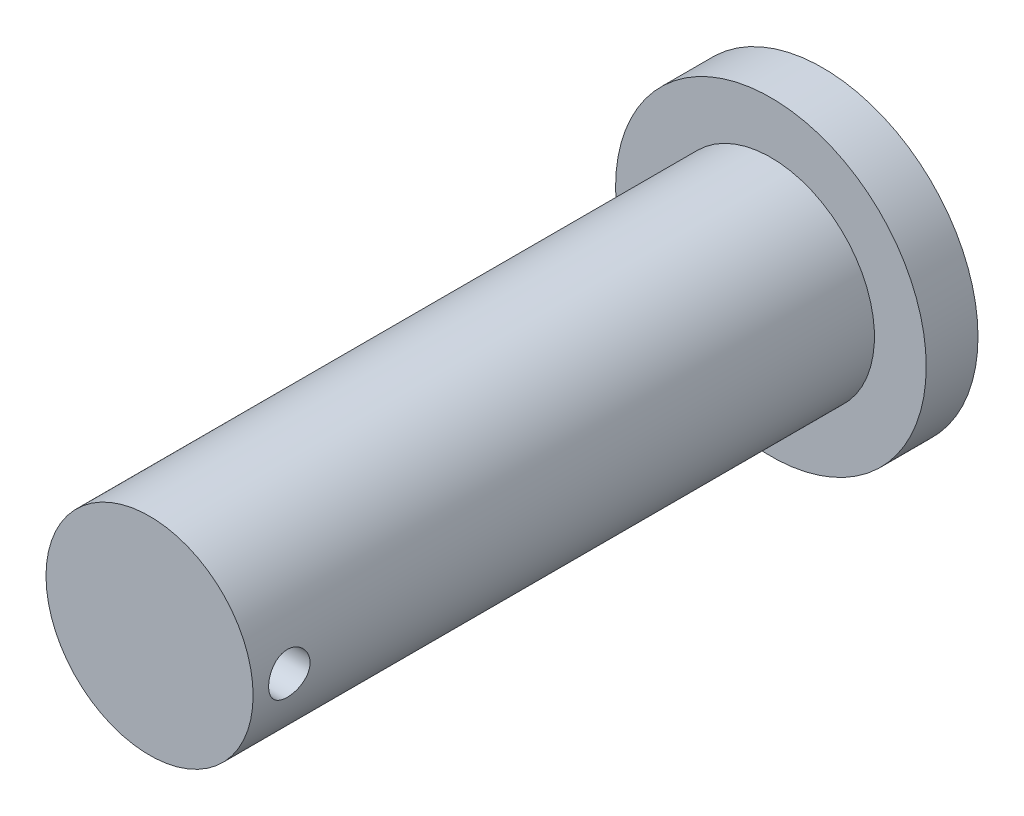
ISO-10303-21;
HEADER;
FILE_DESCRIPTION(('STEP AP214'),'2;1');
FILE_NAME('part.step','',(''),(''),'','','');
FILE_SCHEMA(('AUTOMOTIVE_DESIGN { 1 0 10303 214 1 1 1 1 }'));
ENDSEC;
DATA;
#1=APPLICATION_CONTEXT('core data for automotive mechanical design processes');
#2=APPLICATION_PROTOCOL_DEFINITION('international standard','automotive_design',2000,#1);
#3=PRODUCT_CONTEXT('',#1,'mechanical');
#4=PRODUCT('Part','Part','',(#3));
#5=PRODUCT_RELATED_PRODUCT_CATEGORY('part','',(#4));
#6=PRODUCT_DEFINITION_FORMATION('','',#4);
#7=PRODUCT_DEFINITION_CONTEXT('part definition',#1,'design');
#8=PRODUCT_DEFINITION('design','',#6,#7);
#9=PRODUCT_DEFINITION_SHAPE('','',#8);
#10=(LENGTH_UNIT() NAMED_UNIT(*) SI_UNIT(.MILLI.,.METRE.));
#11=(NAMED_UNIT(*) PLANE_ANGLE_UNIT() SI_UNIT($,.RADIAN.));
#12=(NAMED_UNIT(*) SI_UNIT($,.STERADIAN.) SOLID_ANGLE_UNIT());
#13=UNCERTAINTY_MEASURE_WITH_UNIT(LENGTH_MEASURE(1.E-05),#10,'distance_accuracy_value','');
#14=(GEOMETRIC_REPRESENTATION_CONTEXT(3) GLOBAL_UNCERTAINTY_ASSIGNED_CONTEXT((#13)) GLOBAL_UNIT_ASSIGNED_CONTEXT((#10,
#11,#12)) REPRESENTATION_CONTEXT('',''));
#15=CARTESIAN_POINT('',(0.,0.,0.));
#16=DIRECTION('',(0.,0.,1.));
#17=DIRECTION('',(1.,0.,0.));
#18=AXIS2_PLACEMENT_3D('',#15,#16,#17);
#19=CARTESIAN_POINT('',(0.,0.,32.5));
#20=DIRECTION('',(0.,0.,-1.));
#21=DIRECTION('',(-1.,0.,0.));
#22=AXIS2_PLACEMENT_3D('',#19,#20,#21);
#23=CYLINDRICAL_SURFACE('',#22,5.);
#24=CARTESIAN_POINT('',(-5.,0.,31.75));
#25=CARTESIAN_POINT('',(-4.99999897580871,0.0555769067926332,31.7499979555017));
#26=CARTESIAN_POINT('',(-4.99906385178231,0.111179660201522,31.7453511570324));
#27=CARTESIAN_POINT('',(-4.99542365623231,0.220813507689019,31.7269014998848));
#28=CARTESIAN_POINT('',(-4.99271717860186,0.274843317541356,31.7130913671985));
#29=CARTESIAN_POINT('',(-4.98583649278287,0.379730305263314,31.6767587263792));
#30=CARTESIAN_POINT('',(-4.98166369076718,0.430590467933135,31.6542445631553));
#31=CARTESIAN_POINT('',(-4.97230398035314,0.527807988864227,31.6011677524887));
#32=CARTESIAN_POINT('',(-4.96711713235707,0.574165615075812,31.5706055843928));
#33=CARTESIAN_POINT('',(-4.9562216532997,0.661693477314864,31.5018615057086));
#34=CARTESIAN_POINT('',(-4.95050745504347,0.702793951158523,31.4635916446088));
#35=CARTESIAN_POINT('',(-4.93924180452588,0.778036756608027,31.3807075836083));
#36=CARTESIAN_POINT('',(-4.93369036500424,0.812178544770423,31.3360928886649));
#37=CARTESIAN_POINT('',(-4.92332441812615,0.87283175334762,31.2412838069881));
#38=CARTESIAN_POINT('',(-4.91851707364946,0.899270938865867,31.1910423562036));
#39=CARTESIAN_POINT('',(-4.91026268058418,0.94330566658031,31.0867181809959));
#40=CARTESIAN_POINT('',(-4.90681549761962,0.960902082437239,31.0326358366537));
#41=CARTESIAN_POINT('',(-4.90172805252205,0.986525299884828,30.9229156360921));
#42=CARTESIAN_POINT('',(-4.90006470107188,0.994674497958778,30.8673074558578));
#43=CARTESIAN_POINT('',(-4.89866375060627,1.00155212772612,30.7554901786357));
#44=CARTESIAN_POINT('',(-4.89892595467841,1.0002815227135,30.6992811436799));
#45=CARTESIAN_POINT('',(-4.90132551148185,0.98845457310182,30.588753211979));
#46=CARTESIAN_POINT('',(-4.90343452858764,0.978038540243907,30.5344185943727));
#47=CARTESIAN_POINT('',(-4.90924546160001,0.948437884623053,30.428283923337));
#48=CARTESIAN_POINT('',(-4.91294745357779,0.929252843100683,30.376483991081));
#49=CARTESIAN_POINT('',(-4.92155618500408,0.882524783674722,30.2764847382964));
#50=CARTESIAN_POINT('',(-4.92647089813704,0.854926151232117,30.2283121204308));
#51=CARTESIAN_POINT('',(-4.93694618773062,0.792193574572681,30.1372291500272));
#52=CARTESIAN_POINT('',(-4.94250683838366,0.757058764356831,30.0943194031488));
#53=CARTESIAN_POINT('',(-4.95377021241462,0.679499934560586,30.0141705975431));
#54=CARTESIAN_POINT('',(-4.95947369210905,0.636956161212447,29.9770474321409));
#55=CARTESIAN_POINT('',(-4.97028848714409,0.546185024062011,29.9104461536988));
#56=CARTESIAN_POINT('',(-4.97539979488974,0.497957587379389,29.8809681387064));
#57=CARTESIAN_POINT('',(-4.98446690160887,0.397059386878921,29.830472490774));
#58=CARTESIAN_POINT('',(-4.98842088848272,0.3443818195853,29.8094681063555));
#59=CARTESIAN_POINT('',(-4.99471408987858,0.236148976448665,29.7766395259614));
#60=CARTESIAN_POINT('',(-4.99705350000531,0.18059405007245,29.7648142179264));
#61=CARTESIAN_POINT('',(-4.99982671866868,0.0691794056271514,29.7508435462057));
#62=CARTESIAN_POINT('',(-5.0002917465247,0.0133403283255772,29.7485395804597));
#63=CARTESIAN_POINT('',(-4.99935051930103,-0.097924934192713,29.7532498589422));
#64=CARTESIAN_POINT('',(-4.99794436941446,-0.153351142443792,29.7602635793526));
#65=CARTESIAN_POINT('',(-4.99343832008018,-0.26170565994654,29.783278373544));
#66=CARTESIAN_POINT('',(-4.99035376404206,-0.314651948339902,29.7991980684979));
#67=CARTESIAN_POINT('',(-4.98283552061033,-0.417123627499666,29.8394839826558));
#68=CARTESIAN_POINT('',(-4.97840173214227,-0.466648761637539,29.8638508346768));
#69=CARTESIAN_POINT('',(-4.96859911533295,-0.561541173686217,29.9206824906513));
#70=CARTESIAN_POINT('',(-4.96321950437052,-0.606850126752187,29.9532427810389));
#71=CARTESIAN_POINT('',(-4.95214734829882,-0.691418019119206,30.0254091912073));
#72=CARTESIAN_POINT('',(-4.94645476968388,-0.730676308930762,30.0650160663999));
#73=CARTESIAN_POINT('',(-4.93529303556965,-0.802640590774177,30.1508733518911));
#74=CARTESIAN_POINT('',(-4.92982860233304,-0.835237702448658,30.1972157442213));
#75=CARTESIAN_POINT('',(-4.91984191796194,-0.892185420051208,30.2948113613567));
#76=CARTESIAN_POINT('',(-4.91531962913343,-0.916536355922904,30.3460643895736));
#77=CARTESIAN_POINT('',(-4.90776740584383,-0.956151841581961,30.4517682461496));
#78=CARTESIAN_POINT('',(-4.90472974872187,-0.971463499791052,30.5062008412103));
#79=CARTESIAN_POINT('',(-4.90047436792025,-0.992708651627198,30.6169334534909));
#80=CARTESIAN_POINT('',(-4.89925640691111,-0.998643368225114,30.6732332262094));
#81=CARTESIAN_POINT('',(-4.89879149631379,-1.00092091086747,30.7850088645443));
#82=CARTESIAN_POINT('',(-4.89950919189301,-0.997435788070897,30.840481148927));
#83=CARTESIAN_POINT('',(-4.90275573484614,-0.981352304100062,30.950031649905));
#84=CARTESIAN_POINT('',(-4.90528456767169,-0.9687540161293,31.0041098776948));
#85=CARTESIAN_POINT('',(-4.91185264219159,-0.934878568498956,31.1092277112405));
#86=CARTESIAN_POINT('',(-4.91588821018831,-0.913622506717347,31.1602743605024));
#87=CARTESIAN_POINT('',(-4.9250171497417,-0.863054644601606,31.2581037207344));
#88=CARTESIAN_POINT('',(-4.93011060998894,-0.833742168774884,31.3048860737251));
#89=CARTESIAN_POINT('',(-4.94088960523225,-0.767305914786416,31.3937155721503));
#90=CARTESIAN_POINT('',(-4.946583729097,-0.730057887235183,31.4356687652676));
#91=CARTESIAN_POINT('',(-4.95786081871955,-0.649064369013143,31.5127862055292));
#92=CARTESIAN_POINT('',(-4.96344375863184,-0.605317387153336,31.5479488903173));
#93=CARTESIAN_POINT('',(-4.97393832387971,-0.512017629088247,31.6108346439465));
#94=CARTESIAN_POINT('',(-4.97884231219246,-0.462408884429836,31.63847600328));
#95=CARTESIAN_POINT('',(-4.98735125085,-0.359166360940734,31.6849861225966));
#96=CARTESIAN_POINT('',(-4.99095737138616,-0.305536260863127,31.7038627895325));
#97=CARTESIAN_POINT('',(-4.99576372595371,-0.20982148892378,31.7286519480447));
#98=CARTESIAN_POINT('',(-4.99734303158452,-0.168281664013786,31.7366431937078));
#99=CARTESIAN_POINT('',(-4.99946154139893,-0.0844995252100676,31.7473179123584));
#100=CARTESIAN_POINT('',(-5.00000077873155,-0.0422572337486192,31.7500015545098));
#101=CARTESIAN_POINT('',(-5.,0.,31.75));
#102=B_SPLINE_CURVE_WITH_KNOTS('',3,(#24,#25,#26,#27,#28,#29,#30,#31,#32,#33,#34,#35,#36,#37,
#38,#39,#40,#41,#42,#43,#44,#45,#46,#47,#48,#49,#50,#51,#52,#53,#54,#55,#56,#57,#58,#59,#60,#61,
#62,#63,#64,#65,#66,#67,#68,#69,#70,#71,#72,#73,#74,#75,#76,#77,#78,#79,#80,#81,#82,#83,#84,#85,
#86,#87,#88,#89,#90,#91,#92,#93,#94,#95,#96,#97,#98,#99,#100,#101),.UNSPECIFIED.,.T.,.F.,(4,2,2,
2,2,2,2,2,2,2,2,2,2,2,2,2,2,2,2,2,2,2,2,2,2,2,2,2,2,2,2,2,2,2,2,2,2,2,4),(0.,0.166576130661258,
0.333284650691323,0.499833735250344,0.666372902230866,0.834932670112183,1.00350559674736,
1.17361195005923,1.34370149365198,1.51156185103587,1.67940504281225,1.84471727006278,
2.0100373925373,2.17647490203593,2.3429315474967,2.51238252491351,2.68183567539821,
2.85155274854024,3.02124925698036,3.18810735676266,3.35495607657868,3.52030453950724,
3.68566539216023,3.85305066033359,4.0204538834593,4.19040628579227,4.36035188723467,
4.52940381032724,4.69843368330415,4.86439722567702,5.03035943492609,5.1959196125311,
5.36149367581867,5.52988076239144,5.69830654532931,5.86849496675638,6.03852955517519,
6.16518775289895,6.29184191370997),.UNSPECIFIED.);
#103=CARTESIAN_POINT('',(-5.,0.,31.75));
#104=VERTEX_POINT('',#103);
#105=EDGE_CURVE('E49',#104,#104,#102,.T.);
#106=ORIENTED_EDGE('',*,*,#105,.F.);
#107=EDGE_LOOP('',(#106));
#108=FACE_BOUND('',#107,.T.);
#109=CARTESIAN_POINT('',(5.,0.,31.75));
#110=CARTESIAN_POINT('',(4.99999897580871,-0.0555769067926332,31.7499979555017));
#111=CARTESIAN_POINT('',(4.99906385178231,-0.111179660201522,31.7453511570324));
#112=CARTESIAN_POINT('',(4.99542365623231,-0.220813507689019,31.7269014998848));
#113=CARTESIAN_POINT('',(4.99271717860186,-0.274843317541356,31.7130913671985));
#114=CARTESIAN_POINT('',(4.98583649278287,-0.379730305263314,31.6767587263792));
#115=CARTESIAN_POINT('',(4.98166369076718,-0.430590467933135,31.6542445631553));
#116=CARTESIAN_POINT('',(4.97230398035314,-0.527807988864227,31.6011677524887));
#117=CARTESIAN_POINT('',(4.96711713235707,-0.574165615075812,31.5706055843928));
#118=CARTESIAN_POINT('',(4.9562216532997,-0.661693477314864,31.5018615057086));
#119=CARTESIAN_POINT('',(4.95050745504347,-0.702793951158523,31.4635916446088));
#120=CARTESIAN_POINT('',(4.93924180452588,-0.778036756608027,31.3807075836083));
#121=CARTESIAN_POINT('',(4.93369036500424,-0.812178544770423,31.3360928886649));
#122=CARTESIAN_POINT('',(4.92332441812615,-0.87283175334762,31.2412838069881));
#123=CARTESIAN_POINT('',(4.91851707364946,-0.899270938865867,31.1910423562036));
#124=CARTESIAN_POINT('',(4.91026268058418,-0.94330566658031,31.0867181809959));
#125=CARTESIAN_POINT('',(4.90681549761962,-0.960902082437239,31.0326358366537));
#126=CARTESIAN_POINT('',(4.90172805252205,-0.986525299884828,30.9229156360921));
#127=CARTESIAN_POINT('',(4.90006470107188,-0.994674497958778,30.8673074558578));
#128=CARTESIAN_POINT('',(4.89866375060627,-1.00155212772612,30.7554901786357));
#129=CARTESIAN_POINT('',(4.89892595467841,-1.0002815227135,30.6992811436799));
#130=CARTESIAN_POINT('',(4.90132551148185,-0.98845457310182,30.588753211979));
#131=CARTESIAN_POINT('',(4.90343452858764,-0.978038540243907,30.5344185943727));
#132=CARTESIAN_POINT('',(4.90924546160001,-0.948437884623053,30.428283923337));
#133=CARTESIAN_POINT('',(4.91294745357779,-0.929252843100683,30.376483991081));
#134=CARTESIAN_POINT('',(4.92155618500408,-0.882524783674722,30.2764847382964));
#135=CARTESIAN_POINT('',(4.92647089813704,-0.854926151232117,30.2283121204308));
#136=CARTESIAN_POINT('',(4.93694618773062,-0.792193574572681,30.1372291500272));
#137=CARTESIAN_POINT('',(4.94250683838366,-0.757058764356831,30.0943194031488));
#138=CARTESIAN_POINT('',(4.95377021241462,-0.679499934560586,30.0141705975431));
#139=CARTESIAN_POINT('',(4.95947369210905,-0.636956161212447,29.9770474321409));
#140=CARTESIAN_POINT('',(4.97028848714409,-0.546185024062011,29.9104461536988));
#141=CARTESIAN_POINT('',(4.97539979488974,-0.497957587379389,29.8809681387064));
#142=CARTESIAN_POINT('',(4.98446690160887,-0.397059386878921,29.830472490774));
#143=CARTESIAN_POINT('',(4.98842088848272,-0.3443818195853,29.8094681063555));
#144=CARTESIAN_POINT('',(4.99471408987858,-0.236148976448665,29.7766395259614));
#145=CARTESIAN_POINT('',(4.99705350000531,-0.18059405007245,29.7648142179264));
#146=CARTESIAN_POINT('',(4.99982671866868,-0.0691794056271514,29.7508435462057));
#147=CARTESIAN_POINT('',(5.0002917465247,-0.0133403283255772,29.7485395804597));
#148=CARTESIAN_POINT('',(4.99935051930103,0.097924934192713,29.7532498589422));
#149=CARTESIAN_POINT('',(4.99794436941446,0.153351142443792,29.7602635793526));
#150=CARTESIAN_POINT('',(4.99343832008018,0.26170565994654,29.783278373544));
#151=CARTESIAN_POINT('',(4.99035376404206,0.314651948339902,29.7991980684979));
#152=CARTESIAN_POINT('',(4.98283552061033,0.417123627499666,29.8394839826558));
#153=CARTESIAN_POINT('',(4.97840173214227,0.466648761637539,29.8638508346768));
#154=CARTESIAN_POINT('',(4.96859911533295,0.561541173686217,29.9206824906513));
#155=CARTESIAN_POINT('',(4.96321950437052,0.606850126752187,29.9532427810389));
#156=CARTESIAN_POINT('',(4.95214734829882,0.691418019119206,30.0254091912073));
#157=CARTESIAN_POINT('',(4.94645476968388,0.730676308930762,30.0650160663999));
#158=CARTESIAN_POINT('',(4.93529303556965,0.802640590774177,30.1508733518911));
#159=CARTESIAN_POINT('',(4.92982860233304,0.835237702448658,30.1972157442213));
#160=CARTESIAN_POINT('',(4.91984191796194,0.892185420051208,30.2948113613567));
#161=CARTESIAN_POINT('',(4.91531962913343,0.916536355922904,30.3460643895736));
#162=CARTESIAN_POINT('',(4.90776740584383,0.956151841581961,30.4517682461496));
#163=CARTESIAN_POINT('',(4.90472974872187,0.971463499791052,30.5062008412103));
#164=CARTESIAN_POINT('',(4.90047436792025,0.992708651627198,30.6169334534909));
#165=CARTESIAN_POINT('',(4.89925640691111,0.998643368225114,30.6732332262094));
#166=CARTESIAN_POINT('',(4.89879149631379,1.00092091086747,30.7850088645443));
#167=CARTESIAN_POINT('',(4.89950919189301,0.997435788070897,30.840481148927));
#168=CARTESIAN_POINT('',(4.90275573484614,0.981352304100062,30.950031649905));
#169=CARTESIAN_POINT('',(4.90528456767169,0.9687540161293,31.0041098776948));
#170=CARTESIAN_POINT('',(4.91185264219159,0.934878568498956,31.1092277112405));
#171=CARTESIAN_POINT('',(4.91588821018831,0.913622506717347,31.1602743605024));
#172=CARTESIAN_POINT('',(4.9250171497417,0.863054644601606,31.2581037207344));
#173=CARTESIAN_POINT('',(4.93011060998894,0.833742168774884,31.3048860737251));
#174=CARTESIAN_POINT('',(4.94088960523225,0.767305914786416,31.3937155721503));
#175=CARTESIAN_POINT('',(4.946583729097,0.730057887235183,31.4356687652676));
#176=CARTESIAN_POINT('',(4.95786081871955,0.649064369013143,31.5127862055292));
#177=CARTESIAN_POINT('',(4.96344375863184,0.605317387153336,31.5479488903173));
#178=CARTESIAN_POINT('',(4.97393832387971,0.512017629088247,31.6108346439465));
#179=CARTESIAN_POINT('',(4.97884231219246,0.462408884429836,31.63847600328));
#180=CARTESIAN_POINT('',(4.98735125085,0.359166360940734,31.6849861225966));
#181=CARTESIAN_POINT('',(4.99095737138616,0.305536260863127,31.7038627895325));
#182=CARTESIAN_POINT('',(4.99576372595371,0.20982148892378,31.7286519480447));
#183=CARTESIAN_POINT('',(4.99734303158452,0.168281664013786,31.7366431937078));
#184=CARTESIAN_POINT('',(4.99946154139893,0.0844995252100676,31.7473179123584));
#185=CARTESIAN_POINT('',(5.00000077873155,0.0422572337486192,31.7500015545098));
#186=CARTESIAN_POINT('',(5.,0.,31.75));
#187=B_SPLINE_CURVE_WITH_KNOTS('',3,(#109,#110,#111,#112,#113,#114,#115,#116,#117,#118,#119,
#120,#121,#122,#123,#124,#125,#126,#127,#128,#129,#130,#131,#132,#133,#134,#135,#136,#137,#138,
#139,#140,#141,#142,#143,#144,#145,#146,#147,#148,#149,#150,#151,#152,#153,#154,#155,#156,#157,
#158,#159,#160,#161,#162,#163,#164,#165,#166,#167,#168,#169,#170,#171,#172,#173,#174,#175,#176,
#177,#178,#179,#180,#181,#182,#183,#184,#185,#186),.UNSPECIFIED.,.T.,.F.,(4,2,2,2,2,2,2,2,2,2,2,
2,2,2,2,2,2,2,2,2,2,2,2,2,2,2,2,2,2,2,2,2,2,2,2,2,2,2,4),(0.,0.166576130661258,
0.333284650691323,0.499833735250344,0.666372902230866,0.834932670112183,1.00350559674736,
1.17361195005923,1.34370149365198,1.51156185103587,1.67940504281225,1.84471727006278,
2.0100373925373,2.17647490203593,2.3429315474967,2.51238252491351,2.68183567539821,
2.85155274854024,3.02124925698036,3.18810735676266,3.35495607657868,3.52030453950724,
3.68566539216023,3.85305066033359,4.0204538834593,4.19040628579227,4.36035188723467,
4.52940381032724,4.69843368330415,4.86439722567702,5.03035943492609,5.1959196125311,
5.36149367581867,5.52988076239144,5.69830654532931,5.86849496675638,6.03852955517519,
6.16518775289895,6.29184191370997),.UNSPECIFIED.);
#188=CARTESIAN_POINT('',(5.,0.,31.75));
#189=VERTEX_POINT('',#188);
#190=EDGE_CURVE('E54',#189,#189,#187,.T.);
#191=ORIENTED_EDGE('',*,*,#190,.F.);
#192=EDGE_LOOP('',(#191));
#193=FACE_BOUND('',#192,.T.);
#194=CARTESIAN_POINT('',(0.,0.,32.5));
#195=DIRECTION('',(0.,0.,1.));
#196=DIRECTION('',(1.,0.,0.));
#197=AXIS2_PLACEMENT_3D('',#194,#195,#196);
#198=CIRCLE('',#197,5.);
#199=CARTESIAN_POINT('',(5.,0.,32.5));
#200=VERTEX_POINT('',#199);
#201=EDGE_CURVE('E45',#200,#200,#198,.T.);
#202=ORIENTED_EDGE('',*,*,#201,.F.);
#203=EDGE_LOOP('',(#202));
#204=FACE_BOUND('',#203,.T.);
#205=CARTESIAN_POINT('',(0.,0.,2.5));
#206=DIRECTION('',(0.,0.,-1.));
#207=DIRECTION('',(-1.,0.,0.));
#208=AXIS2_PLACEMENT_3D('',#205,#206,#207);
#209=CIRCLE('',#208,5.);
#210=CARTESIAN_POINT('',(-5.,0.,2.5));
#211=VERTEX_POINT('',#210);
#212=EDGE_CURVE('E10',#211,#211,#209,.T.);
#213=ORIENTED_EDGE('',*,*,#212,.F.);
#214=EDGE_LOOP('',(#213));
#215=FACE_BOUND('',#214,.T.);
#216=ADVANCED_FACE('F38',(#108,#193,#204,#215),#23,.T.);
#217=CARTESIAN_POINT('',(0.,0.,32.5));
#218=DIRECTION('',(0.,0.,1.));
#219=DIRECTION('',(1.,0.,0.));
#220=AXIS2_PLACEMENT_3D('',#217,#218,#219);
#221=PLANE('',#220);
#222=ORIENTED_EDGE('',*,*,#201,.T.);
#223=EDGE_LOOP('',(#222));
#224=FACE_BOUND('',#223,.T.);
#225=ADVANCED_FACE('F74',(#224),#221,.T.);
#226=CARTESIAN_POINT('',(9.,0.,30.75));
#227=DIRECTION('',(-1.,0.,0.));
#228=DIRECTION('',(0.,0.,1.));
#229=AXIS2_PLACEMENT_3D('',#226,#227,#228);
#230=CYLINDRICAL_SURFACE('',#229,1.);
#231=ORIENTED_EDGE('',*,*,#190,.T.);
#232=EDGE_LOOP('',(#231));
#233=FACE_BOUND('',#232,.T.);
#234=ORIENTED_EDGE('',*,*,#105,.T.);
#235=EDGE_LOOP('',(#234));
#236=FACE_BOUND('',#235,.T.);
#237=ADVANCED_FACE('F68',(#233,#236),#230,.F.);
#238=CARTESIAN_POINT('',(0.,0.,2.5));
#239=DIRECTION('',(0.,0.,-1.));
#240=DIRECTION('',(-1.,0.,0.));
#241=AXIS2_PLACEMENT_3D('',#238,#239,#240);
#242=CYLINDRICAL_SURFACE('',#241,7.5);
#243=CARTESIAN_POINT('',(0.,0.,2.5));
#244=DIRECTION('',(0.,0.,-1.));
#245=DIRECTION('',(-1.,0.,0.));
#246=AXIS2_PLACEMENT_3D('',#243,#244,#245);
#247=CIRCLE('',#246,7.5);
#248=CARTESIAN_POINT('',(-7.5,0.,2.5));
#249=VERTEX_POINT('',#248);
#250=EDGE_CURVE('E64',#249,#249,#247,.T.);
#251=ORIENTED_EDGE('',*,*,#250,.T.);
#252=EDGE_LOOP('',(#251));
#253=FACE_BOUND('',#252,.T.);
#254=CARTESIAN_POINT('',(0.,0.,0.));
#255=DIRECTION('',(0.,0.,-1.));
#256=DIRECTION('',(-1.,0.,0.));
#257=AXIS2_PLACEMENT_3D('',#254,#255,#256);
#258=CIRCLE('',#257,7.5);
#259=CARTESIAN_POINT('',(-7.5,0.,0.));
#260=VERTEX_POINT('',#259);
#261=EDGE_CURVE('E57',#260,#260,#258,.T.);
#262=ORIENTED_EDGE('',*,*,#261,.F.);
#263=EDGE_LOOP('',(#262));
#264=FACE_BOUND('',#263,.T.);
#265=ADVANCED_FACE('F73',(#253,#264),#242,.T.);
#266=CARTESIAN_POINT('',(0.,0.,2.5));
#267=DIRECTION('',(0.,0.,-1.));
#268=DIRECTION('',(-1.,0.,0.));
#269=AXIS2_PLACEMENT_3D('',#266,#267,#268);
#270=PLANE('',#269);
#271=ORIENTED_EDGE('',*,*,#212,.T.);
#272=EDGE_LOOP('',(#271));
#273=FACE_BOUND('',#272,.T.);
#274=ORIENTED_EDGE('',*,*,#250,.F.);
#275=EDGE_LOOP('',(#274));
#276=FACE_BOUND('',#275,.T.);
#277=ADVANCED_FACE('F81',(#273,#276),#270,.F.);
#278=CARTESIAN_POINT('',(0.,0.,0.));
#279=DIRECTION('',(0.,0.,1.));
#280=DIRECTION('',(1.,0.,0.));
#281=AXIS2_PLACEMENT_3D('',#278,#279,#280);
#282=PLANE('',#281);
#283=ORIENTED_EDGE('',*,*,#261,.T.);
#284=EDGE_LOOP('',(#283));
#285=FACE_BOUND('',#284,.T.);
#286=ADVANCED_FACE('F79',(#285),#282,.F.);
#287=CLOSED_SHELL('',(#216,#225,#237,#265,#277,#286));
#288=MANIFOLD_SOLID_BREP('B2',#287);
#289=ADVANCED_BREP_SHAPE_REPRESENTATION('',(#18,#288),#14);
#290=SHAPE_DEFINITION_REPRESENTATION(#9,#289);
ENDSEC;
END-ISO-10303-21;
